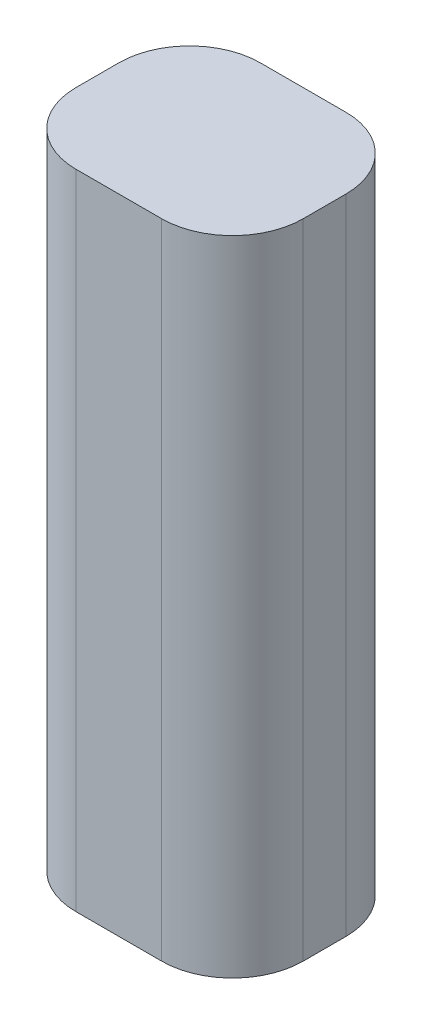
ISO-10303-21;
HEADER;
FILE_DESCRIPTION(('STEP AP214'),'2;1');
FILE_NAME('part.step','',(''),(''),'','','');
FILE_SCHEMA(('AUTOMOTIVE_DESIGN { 1 0 10303 214 1 1 1 1 }'));
ENDSEC;
DATA;
#1=APPLICATION_CONTEXT('core data for automotive mechanical design processes');
#2=APPLICATION_PROTOCOL_DEFINITION('international standard','automotive_design',2000,#1);
#3=PRODUCT_CONTEXT('',#1,'mechanical');
#4=PRODUCT('Part','Part','',(#3));
#5=PRODUCT_RELATED_PRODUCT_CATEGORY('part','',(#4));
#6=PRODUCT_DEFINITION_FORMATION('','',#4);
#7=PRODUCT_DEFINITION_CONTEXT('part definition',#1,'design');
#8=PRODUCT_DEFINITION('design','',#6,#7);
#9=PRODUCT_DEFINITION_SHAPE('','',#8);
#10=(LENGTH_UNIT() NAMED_UNIT(*) SI_UNIT(.MILLI.,.METRE.));
#11=(NAMED_UNIT(*) PLANE_ANGLE_UNIT() SI_UNIT($,.RADIAN.));
#12=(NAMED_UNIT(*) SI_UNIT($,.STERADIAN.) SOLID_ANGLE_UNIT());
#13=UNCERTAINTY_MEASURE_WITH_UNIT(LENGTH_MEASURE(1.E-05),#10,'distance_accuracy_value','');
#14=(GEOMETRIC_REPRESENTATION_CONTEXT(3) GLOBAL_UNCERTAINTY_ASSIGNED_CONTEXT((#13)) GLOBAL_UNIT_ASSIGNED_CONTEXT((#10,
#11,#12)) REPRESENTATION_CONTEXT('',''));
#15=CARTESIAN_POINT('',(0.,0.,0.));
#16=DIRECTION('',(0.,0.,1.));
#17=DIRECTION('',(1.,0.,0.));
#18=AXIS2_PLACEMENT_3D('',#15,#16,#17);
#19=CARTESIAN_POINT('',(2.65,15.,0.));
#20=DIRECTION('',(-1.,0.,0.));
#21=DIRECTION('',(0.,0.,1.));
#22=AXIS2_PLACEMENT_3D('',#19,#20,#21);
#23=PLANE('',#22);
#24=DIRECTION('',(0.,0.,-1.));
#25=VECTOR('',#24,1.);
#26=CARTESIAN_POINT('',(2.65,0.,0.));
#27=LINE('',#26,#25);
#28=CARTESIAN_POINT('',(2.65,0.,0.499999999999998));
#29=VERTEX_POINT('',#28);
#30=CARTESIAN_POINT('',(2.65,0.,-0.499999999999996));
#31=VERTEX_POINT('',#30);
#32=EDGE_CURVE('E129',#29,#31,#27,.T.);
#33=ORIENTED_EDGE('',*,*,#32,.T.);
#34=DIRECTION('',(0.,-1.,0.));
#35=VECTOR('',#34,1.);
#36=CARTESIAN_POINT('',(2.65,15.,-0.499999999999996));
#37=LINE('',#36,#35);
#38=CARTESIAN_POINT('',(2.65,15.,-0.499999999999996));
#39=VERTEX_POINT('',#38);
#40=EDGE_CURVE('E11',#39,#31,#37,.T.);
#41=ORIENTED_EDGE('',*,*,#40,.F.);
#42=DIRECTION('',(0.,0.,-1.));
#43=VECTOR('',#42,1.);
#44=CARTESIAN_POINT('',(2.65,15.,0.));
#45=LINE('',#44,#43);
#46=CARTESIAN_POINT('',(2.65,15.,0.499999999999998));
#47=VERTEX_POINT('',#46);
#48=EDGE_CURVE('E143',#47,#39,#45,.T.);
#49=ORIENTED_EDGE('',*,*,#48,.F.);
#50=DIRECTION('',(0.,-1.,0.));
#51=VECTOR('',#50,1.);
#52=CARTESIAN_POINT('',(2.65,15.,0.499999999999998));
#53=LINE('',#52,#51);
#54=EDGE_CURVE('E125',#47,#29,#53,.T.);
#55=ORIENTED_EDGE('',*,*,#54,.T.);
#56=EDGE_LOOP('',(#33,#41,#49,#55));
#57=FACE_BOUND('',#56,.T.);
#58=ADVANCED_FACE('F33',(#57),#23,.F.);
#59=CARTESIAN_POINT('',(1.,15.,-0.499999999999996));
#60=DIRECTION('',(0.,-1.,0.));
#61=DIRECTION('',(0.,0.,-1.));
#62=AXIS2_PLACEMENT_3D('',#59,#60,#61);
#63=CYLINDRICAL_SURFACE('',#62,1.65);
#64=CARTESIAN_POINT('',(1.,0.,-0.499999999999996));
#65=DIRECTION('',(0.,1.,0.));
#66=DIRECTION('',(0.,0.,1.));
#67=AXIS2_PLACEMENT_3D('',#64,#65,#66);
#68=CIRCLE('',#67,1.65);
#69=CARTESIAN_POINT('',(1.,0.,-2.15));
#70=VERTEX_POINT('',#69);
#71=EDGE_CURVE('E132',#31,#70,#68,.T.);
#72=ORIENTED_EDGE('',*,*,#71,.T.);
#73=DIRECTION('',(0.,-1.,0.));
#74=VECTOR('',#73,1.);
#75=CARTESIAN_POINT('',(1.,15.,-2.15));
#76=LINE('',#75,#74);
#77=CARTESIAN_POINT('',(1.,15.,-2.15));
#78=VERTEX_POINT('',#77);
#79=EDGE_CURVE('E41',#78,#70,#76,.T.);
#80=ORIENTED_EDGE('',*,*,#79,.F.);
#81=CARTESIAN_POINT('',(1.,15.,-0.499999999999996));
#82=DIRECTION('',(0.,1.,0.));
#83=DIRECTION('',(0.,0.,1.));
#84=AXIS2_PLACEMENT_3D('',#81,#82,#83);
#85=CIRCLE('',#84,1.65);
#86=EDGE_CURVE('E92',#39,#78,#85,.T.);
#87=ORIENTED_EDGE('',*,*,#86,.F.);
#88=ORIENTED_EDGE('',*,*,#40,.T.);
#89=EDGE_LOOP('',(#72,#80,#87,#88));
#90=FACE_BOUND('',#89,.T.);
#91=ADVANCED_FACE('F178',(#90),#63,.T.);
#92=CARTESIAN_POINT('',(0.,15.,-2.15));
#93=DIRECTION('',(0.,0.,1.));
#94=DIRECTION('',(1.,0.,0.));
#95=AXIS2_PLACEMENT_3D('',#92,#93,#94);
#96=PLANE('',#95);
#97=DIRECTION('',(-1.,0.,0.));
#98=VECTOR('',#97,1.);
#99=CARTESIAN_POINT('',(0.,0.,-2.15));
#100=LINE('',#99,#98);
#101=CARTESIAN_POINT('',(-1.,0.,-2.15));
#102=VERTEX_POINT('',#101);
#103=EDGE_CURVE('E134',#70,#102,#100,.T.);
#104=ORIENTED_EDGE('',*,*,#103,.T.);
#105=DIRECTION('',(0.,-1.,0.));
#106=VECTOR('',#105,1.);
#107=CARTESIAN_POINT('',(-1.,15.,-2.15));
#108=LINE('',#107,#106);
#109=CARTESIAN_POINT('',(-1.,15.,-2.15));
#110=VERTEX_POINT('',#109);
#111=EDGE_CURVE('E150',#110,#102,#108,.T.);
#112=ORIENTED_EDGE('',*,*,#111,.F.);
#113=DIRECTION('',(-1.,0.,0.));
#114=VECTOR('',#113,1.);
#115=CARTESIAN_POINT('',(0.,15.,-2.15));
#116=LINE('',#115,#114);
#117=EDGE_CURVE('E158',#78,#110,#116,.T.);
#118=ORIENTED_EDGE('',*,*,#117,.F.);
#119=ORIENTED_EDGE('',*,*,#79,.T.);
#120=EDGE_LOOP('',(#104,#112,#118,#119));
#121=FACE_BOUND('',#120,.T.);
#122=ADVANCED_FACE('F156',(#121),#96,.F.);
#123=CARTESIAN_POINT('',(-1.,15.,-0.499999999999997));
#124=DIRECTION('',(0.,-1.,0.));
#125=DIRECTION('',(0.,0.,-1.));
#126=AXIS2_PLACEMENT_3D('',#123,#124,#125);
#127=CYLINDRICAL_SURFACE('',#126,1.65);
#128=CARTESIAN_POINT('',(-1.,0.,-0.499999999999997));
#129=DIRECTION('',(0.,1.,0.));
#130=DIRECTION('',(0.,0.,1.));
#131=AXIS2_PLACEMENT_3D('',#128,#129,#130);
#132=CIRCLE('',#131,1.65);
#133=CARTESIAN_POINT('',(-2.65,0.,-0.499999999999998));
#134=VERTEX_POINT('',#133);
#135=EDGE_CURVE('E136',#102,#134,#132,.T.);
#136=ORIENTED_EDGE('',*,*,#135,.T.);
#137=DIRECTION('',(0.,-1.,0.));
#138=VECTOR('',#137,1.);
#139=CARTESIAN_POINT('',(-2.65,15.,-0.499999999999998));
#140=LINE('',#139,#138);
#141=CARTESIAN_POINT('',(-2.65,15.,-0.499999999999998));
#142=VERTEX_POINT('',#141);
#143=EDGE_CURVE('E147',#142,#134,#140,.T.);
#144=ORIENTED_EDGE('',*,*,#143,.F.);
#145=CARTESIAN_POINT('',(-1.,15.,-0.499999999999997));
#146=DIRECTION('',(0.,1.,0.));
#147=DIRECTION('',(0.,0.,1.));
#148=AXIS2_PLACEMENT_3D('',#145,#146,#147);
#149=CIRCLE('',#148,1.65);
#150=EDGE_CURVE('E170',#110,#142,#149,.T.);
#151=ORIENTED_EDGE('',*,*,#150,.F.);
#152=ORIENTED_EDGE('',*,*,#111,.T.);
#153=EDGE_LOOP('',(#136,#144,#151,#152));
#154=FACE_BOUND('',#153,.T.);
#155=ADVANCED_FACE('F166',(#154),#127,.T.);
#156=CARTESIAN_POINT('',(-2.65,15.,0.));
#157=DIRECTION('',(1.,0.,0.));
#158=DIRECTION('',(0.,0.,-1.));
#159=AXIS2_PLACEMENT_3D('',#156,#157,#158);
#160=PLANE('',#159);
#161=DIRECTION('',(0.,0.,1.));
#162=VECTOR('',#161,1.);
#163=CARTESIAN_POINT('',(-2.65,0.,0.));
#164=LINE('',#163,#162);
#165=CARTESIAN_POINT('',(-2.65,0.,0.499999999999996));
#166=VERTEX_POINT('',#165);
#167=EDGE_CURVE('E138',#134,#166,#164,.T.);
#168=ORIENTED_EDGE('',*,*,#167,.T.);
#169=DIRECTION('',(0.,-1.,0.));
#170=VECTOR('',#169,1.);
#171=CARTESIAN_POINT('',(-2.65,15.,0.499999999999996));
#172=LINE('',#171,#170);
#173=CARTESIAN_POINT('',(-2.65,15.,0.499999999999996));
#174=VERTEX_POINT('',#173);
#175=EDGE_CURVE('E120',#174,#166,#172,.T.);
#176=ORIENTED_EDGE('',*,*,#175,.F.);
#177=DIRECTION('',(0.,0.,1.));
#178=VECTOR('',#177,1.);
#179=CARTESIAN_POINT('',(-2.65,15.,0.));
#180=LINE('',#179,#178);
#181=EDGE_CURVE('E111',#142,#174,#180,.T.);
#182=ORIENTED_EDGE('',*,*,#181,.F.);
#183=ORIENTED_EDGE('',*,*,#143,.T.);
#184=EDGE_LOOP('',(#168,#176,#182,#183));
#185=FACE_BOUND('',#184,.T.);
#186=ADVANCED_FACE('F169',(#185),#160,.F.);
#187=CARTESIAN_POINT('',(-1.,15.,0.499999999999997));
#188=DIRECTION('',(0.,-1.,0.));
#189=DIRECTION('',(0.,0.,-1.));
#190=AXIS2_PLACEMENT_3D('',#187,#188,#189);
#191=CYLINDRICAL_SURFACE('',#190,1.65);
#192=CARTESIAN_POINT('',(-1.,0.,0.499999999999997));
#193=DIRECTION('',(0.,1.,0.));
#194=DIRECTION('',(0.,0.,1.));
#195=AXIS2_PLACEMENT_3D('',#192,#193,#194);
#196=CIRCLE('',#195,1.65);
#197=CARTESIAN_POINT('',(-0.999999955797257,0.,2.15));
#198=VERTEX_POINT('',#197);
#199=EDGE_CURVE('E119',#166,#198,#196,.T.);
#200=ORIENTED_EDGE('',*,*,#199,.T.);
#201=DIRECTION('',(0.,-1.,0.));
#202=VECTOR('',#201,1.);
#203=CARTESIAN_POINT('',(-0.999999955797257,15.,2.15));
#204=LINE('',#203,#202);
#205=CARTESIAN_POINT('',(-0.999999955797257,15.,2.15));
#206=VERTEX_POINT('',#205);
#207=EDGE_CURVE('E116',#206,#198,#204,.T.);
#208=ORIENTED_EDGE('',*,*,#207,.F.);
#209=CARTESIAN_POINT('',(-1.,15.,0.499999999999997));
#210=DIRECTION('',(0.,1.,0.));
#211=DIRECTION('',(0.,0.,1.));
#212=AXIS2_PLACEMENT_3D('',#209,#210,#211);
#213=CIRCLE('',#212,1.65);
#214=EDGE_CURVE('E105',#174,#206,#213,.T.);
#215=ORIENTED_EDGE('',*,*,#214,.F.);
#216=ORIENTED_EDGE('',*,*,#175,.T.);
#217=EDGE_LOOP('',(#200,#208,#215,#216));
#218=FACE_BOUND('',#217,.T.);
#219=ADVANCED_FACE('F117',(#218),#191,.T.);
#220=CARTESIAN_POINT('',(0.,15.,2.15));
#221=DIRECTION('',(0.,0.,-1.));
#222=DIRECTION('',(-1.,0.,0.));
#223=AXIS2_PLACEMENT_3D('',#220,#221,#222);
#224=PLANE('',#223);
#225=DIRECTION('',(1.,0.,0.));
#226=VECTOR('',#225,1.);
#227=CARTESIAN_POINT('',(0.,0.,2.15));
#228=LINE('',#227,#226);
#229=CARTESIAN_POINT('',(1.,0.,2.15));
#230=VERTEX_POINT('',#229);
#231=EDGE_CURVE('E78',#198,#230,#228,.T.);
#232=ORIENTED_EDGE('',*,*,#231,.T.);
#233=DIRECTION('',(0.,-1.,0.));
#234=VECTOR('',#233,1.);
#235=CARTESIAN_POINT('',(1.,15.,2.15));
#236=LINE('',#235,#234);
#237=CARTESIAN_POINT('',(1.,15.,2.15));
#238=VERTEX_POINT('',#237);
#239=EDGE_CURVE('E121',#238,#230,#236,.T.);
#240=ORIENTED_EDGE('',*,*,#239,.F.);
#241=DIRECTION('',(1.,0.,0.));
#242=VECTOR('',#241,1.);
#243=CARTESIAN_POINT('',(0.,15.,2.15));
#244=LINE('',#243,#242);
#245=EDGE_CURVE('E109',#206,#238,#244,.T.);
#246=ORIENTED_EDGE('',*,*,#245,.F.);
#247=ORIENTED_EDGE('',*,*,#207,.T.);
#248=EDGE_LOOP('',(#232,#240,#246,#247));
#249=FACE_BOUND('',#248,.T.);
#250=ADVANCED_FACE('F123',(#249),#224,.F.);
#251=CARTESIAN_POINT('',(1.,15.,0.499999999999998));
#252=DIRECTION('',(0.,-1.,0.));
#253=DIRECTION('',(0.,0.,-1.));
#254=AXIS2_PLACEMENT_3D('',#251,#252,#253);
#255=CYLINDRICAL_SURFACE('',#254,1.65);
#256=CARTESIAN_POINT('',(1.,0.,0.499999999999998));
#257=DIRECTION('',(0.,1.,0.));
#258=DIRECTION('',(0.,0.,1.));
#259=AXIS2_PLACEMENT_3D('',#256,#257,#258);
#260=CIRCLE('',#259,1.65);
#261=EDGE_CURVE('E84',#230,#29,#260,.T.);
#262=ORIENTED_EDGE('',*,*,#261,.T.);
#263=ORIENTED_EDGE('',*,*,#54,.F.);
#264=CARTESIAN_POINT('',(1.,15.,0.499999999999998));
#265=DIRECTION('',(0.,1.,0.));
#266=DIRECTION('',(0.,0.,1.));
#267=AXIS2_PLACEMENT_3D('',#264,#265,#266);
#268=CIRCLE('',#267,1.65);
#269=EDGE_CURVE('E49',#238,#47,#268,.T.);
#270=ORIENTED_EDGE('',*,*,#269,.F.);
#271=ORIENTED_EDGE('',*,*,#239,.T.);
#272=EDGE_LOOP('',(#262,#263,#270,#271));
#273=FACE_BOUND('',#272,.T.);
#274=ADVANCED_FACE('F194',(#273),#255,.T.);
#275=CARTESIAN_POINT('',(0.,15.,0.));
#276=DIRECTION('',(0.,1.,0.));
#277=DIRECTION('',(0.,0.,1.));
#278=AXIS2_PLACEMENT_3D('',#275,#276,#277);
#279=PLANE('',#278);
#280=ORIENTED_EDGE('',*,*,#48,.T.);
#281=ORIENTED_EDGE('',*,*,#86,.T.);
#282=ORIENTED_EDGE('',*,*,#117,.T.);
#283=ORIENTED_EDGE('',*,*,#150,.T.);
#284=ORIENTED_EDGE('',*,*,#181,.T.);
#285=ORIENTED_EDGE('',*,*,#214,.T.);
#286=ORIENTED_EDGE('',*,*,#245,.T.);
#287=ORIENTED_EDGE('',*,*,#269,.T.);
#288=EDGE_LOOP('',(#280,#281,#282,#283,#284,#285,#286,#287));
#289=FACE_BOUND('',#288,.T.);
#290=ADVANCED_FACE('F107',(#289),#279,.T.);
#291=CARTESIAN_POINT('',(0.,0.,0.));
#292=DIRECTION('',(0.,1.,0.));
#293=DIRECTION('',(0.,0.,1.));
#294=AXIS2_PLACEMENT_3D('',#291,#292,#293);
#295=PLANE('',#294);
#296=ORIENTED_EDGE('',*,*,#32,.F.);
#297=ORIENTED_EDGE('',*,*,#261,.F.);
#298=ORIENTED_EDGE('',*,*,#231,.F.);
#299=ORIENTED_EDGE('',*,*,#199,.F.);
#300=ORIENTED_EDGE('',*,*,#167,.F.);
#301=ORIENTED_EDGE('',*,*,#135,.F.);
#302=ORIENTED_EDGE('',*,*,#103,.F.);
#303=ORIENTED_EDGE('',*,*,#71,.F.);
#304=EDGE_LOOP('',(#296,#297,#298,#299,#300,#301,#302,#303));
#305=FACE_BOUND('',#304,.T.);
#306=ADVANCED_FACE('F162',(#305),#295,.F.);
#307=CLOSED_SHELL('',(#58,#91,#122,#155,#186,#219,#250,#274,#290,#306));
#308=MANIFOLD_SOLID_BREP('B2',#307);
#309=ADVANCED_BREP_SHAPE_REPRESENTATION('',(#18,#308),#14);
#310=SHAPE_DEFINITION_REPRESENTATION(#9,#309);
ENDSEC;
END-ISO-10303-21;
